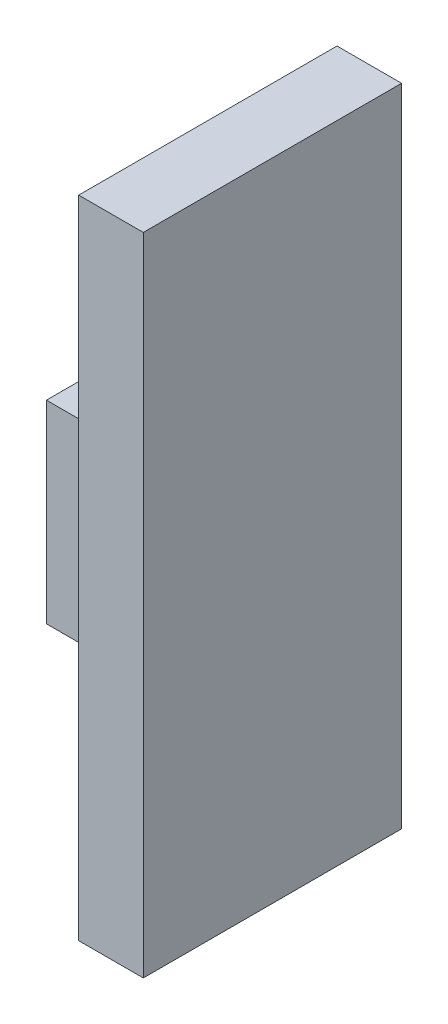
ISO-10303-21;
HEADER;
FILE_DESCRIPTION(('STEP AP214'),'2;1');
FILE_NAME('part.step','',(''),(''),'','','');
FILE_SCHEMA(('AUTOMOTIVE_DESIGN { 1 0 10303 214 1 1 1 1 }'));
ENDSEC;
DATA;
#1=APPLICATION_CONTEXT('core data for automotive mechanical design processes');
#2=APPLICATION_PROTOCOL_DEFINITION('international standard','automotive_design',2000,#1);
#3=PRODUCT_CONTEXT('',#1,'mechanical');
#4=PRODUCT('Part','Part','',(#3));
#5=PRODUCT_RELATED_PRODUCT_CATEGORY('part','',(#4));
#6=PRODUCT_DEFINITION_FORMATION('','',#4);
#7=PRODUCT_DEFINITION_CONTEXT('part definition',#1,'design');
#8=PRODUCT_DEFINITION('design','',#6,#7);
#9=PRODUCT_DEFINITION_SHAPE('','',#8);
#10=(LENGTH_UNIT() NAMED_UNIT(*) SI_UNIT(.MILLI.,.METRE.));
#11=(NAMED_UNIT(*) PLANE_ANGLE_UNIT() SI_UNIT($,.RADIAN.));
#12=(NAMED_UNIT(*) SI_UNIT($,.STERADIAN.) SOLID_ANGLE_UNIT());
#13=UNCERTAINTY_MEASURE_WITH_UNIT(LENGTH_MEASURE(1.E-05),#10,'distance_accuracy_value','');
#14=(GEOMETRIC_REPRESENTATION_CONTEXT(3) GLOBAL_UNCERTAINTY_ASSIGNED_CONTEXT((#13)) GLOBAL_UNIT_ASSIGNED_CONTEXT((#10,
#11,#12)) REPRESENTATION_CONTEXT('',''));
#15=CARTESIAN_POINT('',(0.,0.,0.));
#16=DIRECTION('',(0.,0.,1.));
#17=DIRECTION('',(1.,0.,0.));
#18=AXIS2_PLACEMENT_3D('',#15,#16,#17);
#19=CARTESIAN_POINT('',(0.,0.,0.));
#20=DIRECTION('',(1.,0.,0.));
#21=DIRECTION('',(0.,0.,-1.));
#22=AXIS2_PLACEMENT_3D('',#19,#20,#21);
#23=PLANE('',#22);
#24=DIRECTION('',(0.,-1.,0.));
#25=VECTOR('',#24,1.);
#26=CARTESIAN_POINT('',(0.,50.,20.));
#27=LINE('',#26,#25);
#28=CARTESIAN_POINT('',(0.,50.,20.));
#29=VERTEX_POINT('',#28);
#30=CARTESIAN_POINT('',(0.,-50.,20.));
#31=VERTEX_POINT('',#30);
#32=EDGE_CURVE('E128',#29,#31,#27,.T.);
#33=ORIENTED_EDGE('',*,*,#32,.F.);
#34=DIRECTION('',(0.,0.,1.));
#35=VECTOR('',#34,1.);
#36=CARTESIAN_POINT('',(0.,50.,20.));
#37=LINE('',#36,#35);
#38=CARTESIAN_POINT('',(0.,50.,-20.));
#39=VERTEX_POINT('',#38);
#40=EDGE_CURVE('E141',#39,#29,#37,.T.);
#41=ORIENTED_EDGE('',*,*,#40,.F.);
#42=DIRECTION('',(0.,1.,0.));
#43=VECTOR('',#42,1.);
#44=CARTESIAN_POINT('',(0.,-50.,-20.));
#45=LINE('',#44,#43);
#46=CARTESIAN_POINT('',(0.,-50.,-20.));
#47=VERTEX_POINT('',#46);
#48=EDGE_CURVE('E149',#47,#39,#45,.T.);
#49=ORIENTED_EDGE('',*,*,#48,.F.);
#50=DIRECTION('',(0.,0.,-1.));
#51=VECTOR('',#50,1.);
#52=CARTESIAN_POINT('',(0.,-50.,20.));
#53=LINE('',#52,#51);
#54=EDGE_CURVE('E131',#31,#47,#53,.T.);
#55=ORIENTED_EDGE('',*,*,#54,.F.);
#56=EDGE_LOOP('',(#33,#41,#49,#55));
#57=FACE_BOUND('',#56,.T.);
#58=DIRECTION('',(0.,0.,1.));
#59=VECTOR('',#58,1.);
#60=CARTESIAN_POINT('',(0.,-15.,15.));
#61=LINE('',#60,#59);
#62=CARTESIAN_POINT('',(0.,-15.,-15.));
#63=VERTEX_POINT('',#62);
#64=CARTESIAN_POINT('',(0.,-15.,15.));
#65=VERTEX_POINT('',#64);
#66=EDGE_CURVE('E58',#63,#65,#61,.T.);
#67=ORIENTED_EDGE('',*,*,#66,.F.);
#68=DIRECTION('',(0.,-1.,0.));
#69=VECTOR('',#68,1.);
#70=CARTESIAN_POINT('',(0.,15.,-15.));
#71=LINE('',#70,#69);
#72=CARTESIAN_POINT('',(0.,15.,-15.));
#73=VERTEX_POINT('',#72);
#74=EDGE_CURVE('E62',#73,#63,#71,.T.);
#75=ORIENTED_EDGE('',*,*,#74,.F.);
#76=DIRECTION('',(0.,0.,-1.));
#77=VECTOR('',#76,1.);
#78=CARTESIAN_POINT('',(0.,15.,-15.));
#79=LINE('',#78,#77);
#80=CARTESIAN_POINT('',(0.,15.,15.));
#81=VERTEX_POINT('',#80);
#82=EDGE_CURVE('E236',#81,#73,#79,.T.);
#83=ORIENTED_EDGE('',*,*,#82,.F.);
#84=DIRECTION('',(0.,1.,0.));
#85=VECTOR('',#84,1.);
#86=CARTESIAN_POINT('',(0.,15.,15.));
#87=LINE('',#86,#85);
#88=EDGE_CURVE('E227',#65,#81,#87,.T.);
#89=ORIENTED_EDGE('',*,*,#88,.F.);
#90=EDGE_LOOP('',(#67,#75,#83,#89));
#91=FACE_BOUND('',#90,.T.);
#92=ADVANCED_FACE('F43',(#57,#91),#23,.F.);
#93=CARTESIAN_POINT('',(10.,50.,20.));
#94=DIRECTION('',(0.,0.,-1.));
#95=DIRECTION('',(0.,1.,0.));
#96=AXIS2_PLACEMENT_3D('',#93,#94,#95);
#97=PLANE('',#96);
#98=ORIENTED_EDGE('',*,*,#32,.T.);
#99=DIRECTION('',(-1.,0.,0.));
#100=VECTOR('',#99,1.);
#101=CARTESIAN_POINT('',(10.,-50.,20.));
#102=LINE('',#101,#100);
#103=CARTESIAN_POINT('',(10.,-50.,20.));
#104=VERTEX_POINT('',#103);
#105=EDGE_CURVE('E11',#104,#31,#102,.T.);
#106=ORIENTED_EDGE('',*,*,#105,.F.);
#107=DIRECTION('',(0.,-1.,0.));
#108=VECTOR('',#107,1.);
#109=CARTESIAN_POINT('',(10.,50.,20.));
#110=LINE('',#109,#108);
#111=CARTESIAN_POINT('',(10.,50.,20.));
#112=VERTEX_POINT('',#111);
#113=EDGE_CURVE('E137',#112,#104,#110,.T.);
#114=ORIENTED_EDGE('',*,*,#113,.F.);
#115=DIRECTION('',(-1.,0.,0.));
#116=VECTOR('',#115,1.);
#117=CARTESIAN_POINT('',(10.,50.,20.));
#118=LINE('',#117,#116);
#119=EDGE_CURVE('E146',#112,#29,#118,.T.);
#120=ORIENTED_EDGE('',*,*,#119,.T.);
#121=EDGE_LOOP('',(#98,#106,#114,#120));
#122=FACE_BOUND('',#121,.T.);
#123=ADVANCED_FACE('F45',(#122),#97,.F.);
#124=CARTESIAN_POINT('',(10.,-50.,20.));
#125=DIRECTION('',(0.,1.,0.));
#126=DIRECTION('',(0.,0.,1.));
#127=AXIS2_PLACEMENT_3D('',#124,#125,#126);
#128=PLANE('',#127);
#129=ORIENTED_EDGE('',*,*,#54,.T.);
#130=DIRECTION('',(-1.,0.,0.));
#131=VECTOR('',#130,1.);
#132=CARTESIAN_POINT('',(10.,-50.,-20.));
#133=LINE('',#132,#131);
#134=CARTESIAN_POINT('',(10.,-50.,-20.));
#135=VERTEX_POINT('',#134);
#136=EDGE_CURVE('E51',#135,#47,#133,.T.);
#137=ORIENTED_EDGE('',*,*,#136,.F.);
#138=DIRECTION('',(0.,0.,-1.));
#139=VECTOR('',#138,1.);
#140=CARTESIAN_POINT('',(10.,-50.,20.));
#141=LINE('',#140,#139);
#142=EDGE_CURVE('E140',#104,#135,#141,.T.);
#143=ORIENTED_EDGE('',*,*,#142,.F.);
#144=ORIENTED_EDGE('',*,*,#105,.T.);
#145=EDGE_LOOP('',(#129,#137,#143,#144));
#146=FACE_BOUND('',#145,.T.);
#147=ADVANCED_FACE('F176',(#146),#128,.F.);
#148=CARTESIAN_POINT('',(10.,-50.,-20.));
#149=DIRECTION('',(0.,0.,1.));
#150=DIRECTION('',(1.,0.,0.));
#151=AXIS2_PLACEMENT_3D('',#148,#149,#150);
#152=PLANE('',#151);
#153=ORIENTED_EDGE('',*,*,#48,.T.);
#154=DIRECTION('',(-1.,0.,0.));
#155=VECTOR('',#154,1.);
#156=CARTESIAN_POINT('',(10.,50.,-20.));
#157=LINE('',#156,#155);
#158=CARTESIAN_POINT('',(10.,50.,-20.));
#159=VERTEX_POINT('',#158);
#160=EDGE_CURVE('E154',#159,#39,#157,.T.);
#161=ORIENTED_EDGE('',*,*,#160,.F.);
#162=DIRECTION('',(0.,1.,0.));
#163=VECTOR('',#162,1.);
#164=CARTESIAN_POINT('',(10.,-50.,-20.));
#165=LINE('',#164,#163);
#166=EDGE_CURVE('E143',#135,#159,#165,.T.);
#167=ORIENTED_EDGE('',*,*,#166,.F.);
#168=ORIENTED_EDGE('',*,*,#136,.T.);
#169=EDGE_LOOP('',(#153,#161,#167,#168));
#170=FACE_BOUND('',#169,.T.);
#171=ADVANCED_FACE('F161',(#170),#152,.F.);
#172=CARTESIAN_POINT('',(10.,50.,20.));
#173=DIRECTION('',(0.,-1.,0.));
#174=DIRECTION('',(0.,0.,-1.));
#175=AXIS2_PLACEMENT_3D('',#172,#173,#174);
#176=PLANE('',#175);
#177=ORIENTED_EDGE('',*,*,#40,.T.);
#178=ORIENTED_EDGE('',*,*,#119,.F.);
#179=DIRECTION('',(0.,0.,1.));
#180=VECTOR('',#179,1.);
#181=CARTESIAN_POINT('',(10.,50.,20.));
#182=LINE('',#181,#180);
#183=EDGE_CURVE('E145',#159,#112,#182,.T.);
#184=ORIENTED_EDGE('',*,*,#183,.F.);
#185=ORIENTED_EDGE('',*,*,#160,.T.);
#186=EDGE_LOOP('',(#177,#178,#184,#185));
#187=FACE_BOUND('',#186,.T.);
#188=ADVANCED_FACE('F169',(#187),#176,.F.);
#189=CARTESIAN_POINT('',(10.,0.,0.));
#190=DIRECTION('',(1.,0.,0.));
#191=DIRECTION('',(0.,0.,-1.));
#192=AXIS2_PLACEMENT_3D('',#189,#190,#191);
#193=PLANE('',#192);
#194=ORIENTED_EDGE('',*,*,#113,.T.);
#195=ORIENTED_EDGE('',*,*,#142,.T.);
#196=ORIENTED_EDGE('',*,*,#166,.T.);
#197=ORIENTED_EDGE('',*,*,#183,.T.);
#198=EDGE_LOOP('',(#194,#195,#196,#197));
#199=FACE_BOUND('',#198,.T.);
#200=ADVANCED_FACE('F175',(#199),#193,.T.);
#201=CARTESIAN_POINT('',(-10.,-15.,15.));
#202=DIRECTION('',(0.,1.,0.));
#203=DIRECTION('',(0.,0.,1.));
#204=AXIS2_PLACEMENT_3D('',#201,#202,#203);
#205=PLANE('',#204);
#206=ORIENTED_EDGE('',*,*,#66,.T.);
#207=DIRECTION('',(1.,0.,0.));
#208=VECTOR('',#207,1.);
#209=CARTESIAN_POINT('',(-10.,-15.,15.));
#210=LINE('',#209,#208);
#211=CARTESIAN_POINT('',(-10.,-15.,15.));
#212=VERTEX_POINT('',#211);
#213=EDGE_CURVE('E111',#212,#65,#210,.T.);
#214=ORIENTED_EDGE('',*,*,#213,.F.);
#215=DIRECTION('',(0.,0.,1.));
#216=VECTOR('',#215,1.);
#217=CARTESIAN_POINT('',(-10.,-15.,15.));
#218=LINE('',#217,#216);
#219=CARTESIAN_POINT('',(-10.,-15.,-15.));
#220=VERTEX_POINT('',#219);
#221=EDGE_CURVE('E117',#220,#212,#218,.T.);
#222=ORIENTED_EDGE('',*,*,#221,.F.);
#223=DIRECTION('',(1.,0.,0.));
#224=VECTOR('',#223,1.);
#225=CARTESIAN_POINT('',(-10.,-15.,-15.));
#226=LINE('',#225,#224);
#227=EDGE_CURVE('E233',#220,#63,#226,.T.);
#228=ORIENTED_EDGE('',*,*,#227,.T.);
#229=EDGE_LOOP('',(#206,#214,#222,#228));
#230=FACE_BOUND('',#229,.T.);
#231=ADVANCED_FACE('F127',(#230),#205,.F.);
#232=CARTESIAN_POINT('',(-10.,15.,15.));
#233=DIRECTION('',(0.,0.,-1.));
#234=DIRECTION('',(0.,1.,0.));
#235=AXIS2_PLACEMENT_3D('',#232,#233,#234);
#236=PLANE('',#235);
#237=ORIENTED_EDGE('',*,*,#88,.T.);
#238=DIRECTION('',(1.,0.,0.));
#239=VECTOR('',#238,1.);
#240=CARTESIAN_POINT('',(-10.,15.,15.));
#241=LINE('',#240,#239);
#242=CARTESIAN_POINT('',(-10.,15.,15.));
#243=VERTEX_POINT('',#242);
#244=EDGE_CURVE('E113',#243,#81,#241,.T.);
#245=ORIENTED_EDGE('',*,*,#244,.F.);
#246=DIRECTION('',(0.,1.,0.));
#247=VECTOR('',#246,1.);
#248=CARTESIAN_POINT('',(-10.,15.,15.));
#249=LINE('',#248,#247);
#250=EDGE_CURVE('E106',#212,#243,#249,.T.);
#251=ORIENTED_EDGE('',*,*,#250,.F.);
#252=ORIENTED_EDGE('',*,*,#213,.T.);
#253=EDGE_LOOP('',(#237,#245,#251,#252));
#254=FACE_BOUND('',#253,.T.);
#255=ADVANCED_FACE('F109',(#254),#236,.F.);
#256=CARTESIAN_POINT('',(-10.,15.,-15.));
#257=DIRECTION('',(0.,-1.,0.));
#258=DIRECTION('',(0.,0.,-1.));
#259=AXIS2_PLACEMENT_3D('',#256,#257,#258);
#260=PLANE('',#259);
#261=ORIENTED_EDGE('',*,*,#82,.T.);
#262=DIRECTION('',(1.,0.,0.));
#263=VECTOR('',#262,1.);
#264=CARTESIAN_POINT('',(-10.,15.,-15.));
#265=LINE('',#264,#263);
#266=CARTESIAN_POINT('',(-10.,15.,-15.));
#267=VERTEX_POINT('',#266);
#268=EDGE_CURVE('E133',#267,#73,#265,.T.);
#269=ORIENTED_EDGE('',*,*,#268,.F.);
#270=DIRECTION('',(0.,0.,-1.));
#271=VECTOR('',#270,1.);
#272=CARTESIAN_POINT('',(-10.,15.,-15.));
#273=LINE('',#272,#271);
#274=EDGE_CURVE('E116',#243,#267,#273,.T.);
#275=ORIENTED_EDGE('',*,*,#274,.F.);
#276=ORIENTED_EDGE('',*,*,#244,.T.);
#277=EDGE_LOOP('',(#261,#269,#275,#276));
#278=FACE_BOUND('',#277,.T.);
#279=ADVANCED_FACE('F200',(#278),#260,.F.);
#280=CARTESIAN_POINT('',(-10.,15.,-15.));
#281=DIRECTION('',(0.,0.,1.));
#282=DIRECTION('',(1.,0.,0.));
#283=AXIS2_PLACEMENT_3D('',#280,#281,#282);
#284=PLANE('',#283);
#285=ORIENTED_EDGE('',*,*,#74,.T.);
#286=ORIENTED_EDGE('',*,*,#227,.F.);
#287=DIRECTION('',(0.,-1.,0.));
#288=VECTOR('',#287,1.);
#289=CARTESIAN_POINT('',(-10.,15.,-15.));
#290=LINE('',#289,#288);
#291=EDGE_CURVE('E122',#267,#220,#290,.T.);
#292=ORIENTED_EDGE('',*,*,#291,.F.);
#293=ORIENTED_EDGE('',*,*,#268,.T.);
#294=EDGE_LOOP('',(#285,#286,#292,#293));
#295=FACE_BOUND('',#294,.T.);
#296=ADVANCED_FACE('F205',(#295),#284,.F.);
#297=CARTESIAN_POINT('',(-10.,0.,0.));
#298=DIRECTION('',(-1.,0.,0.));
#299=DIRECTION('',(0.,0.,1.));
#300=AXIS2_PLACEMENT_3D('',#297,#298,#299);
#301=PLANE('',#300);
#302=CARTESIAN_POINT('',(-10.,0.,0.));
#303=DIRECTION('',(-1.,0.,0.));
#304=DIRECTION('',(0.,0.,1.));
#305=AXIS2_PLACEMENT_3D('',#302,#303,#304);
#306=CIRCLE('',#305,10.);
#307=CARTESIAN_POINT('',(-10.,0.,10.));
#308=VERTEX_POINT('',#307);
#309=EDGE_CURVE('E225',#308,#308,#306,.T.);
#310=ORIENTED_EDGE('',*,*,#309,.F.);
#311=EDGE_LOOP('',(#310));
#312=FACE_BOUND('',#311,.T.);
#313=ORIENTED_EDGE('',*,*,#221,.T.);
#314=ORIENTED_EDGE('',*,*,#250,.T.);
#315=ORIENTED_EDGE('',*,*,#274,.T.);
#316=ORIENTED_EDGE('',*,*,#291,.T.);
#317=EDGE_LOOP('',(#313,#314,#315,#316));
#318=FACE_BOUND('',#317,.T.);
#319=ADVANCED_FACE('F120',(#312,#318),#301,.T.);
#320=CARTESIAN_POINT('',(0.,0.,0.));
#321=DIRECTION('',(-1.,0.,0.));
#322=DIRECTION('',(0.,0.,1.));
#323=AXIS2_PLACEMENT_3D('',#320,#321,#322);
#324=CYLINDRICAL_SURFACE('',#323,10.);
#325=CARTESIAN_POINT('',(0.,0.,0.));
#326=DIRECTION('',(-1.,0.,0.));
#327=DIRECTION('',(0.,0.,1.));
#328=AXIS2_PLACEMENT_3D('',#325,#326,#327);
#329=CIRCLE('',#328,10.);
#330=CARTESIAN_POINT('',(0.,0.,10.));
#331=VERTEX_POINT('',#330);
#332=EDGE_CURVE('E224',#331,#331,#329,.T.);
#333=ORIENTED_EDGE('',*,*,#332,.F.);
#334=EDGE_LOOP('',(#333));
#335=FACE_BOUND('',#334,.T.);
#336=ORIENTED_EDGE('',*,*,#309,.T.);
#337=EDGE_LOOP('',(#336));
#338=FACE_BOUND('',#337,.T.);
#339=ADVANCED_FACE('F212',(#335,#338),#324,.F.);
#340=CARTESIAN_POINT('',(0.,0.,0.));
#341=DIRECTION('',(-1.,0.,0.));
#342=DIRECTION('',(0.,0.,1.));
#343=AXIS2_PLACEMENT_3D('',#340,#341,#342);
#344=PLANE('',#343);
#345=ORIENTED_EDGE('',*,*,#332,.T.);
#346=EDGE_LOOP('',(#345));
#347=FACE_BOUND('',#346,.T.);
#348=ADVANCED_FACE('F216',(#347),#344,.T.);
#349=CLOSED_SHELL('',(#92,#123,#147,#171,#188,#200,#231,#255,#279,#296,#319,#339,#348));
#350=MANIFOLD_SOLID_BREP('B2',#349);
#351=ADVANCED_BREP_SHAPE_REPRESENTATION('',(#18,#350),#14);
#352=SHAPE_DEFINITION_REPRESENTATION(#9,#351);
ENDSEC;
END-ISO-10303-21;
